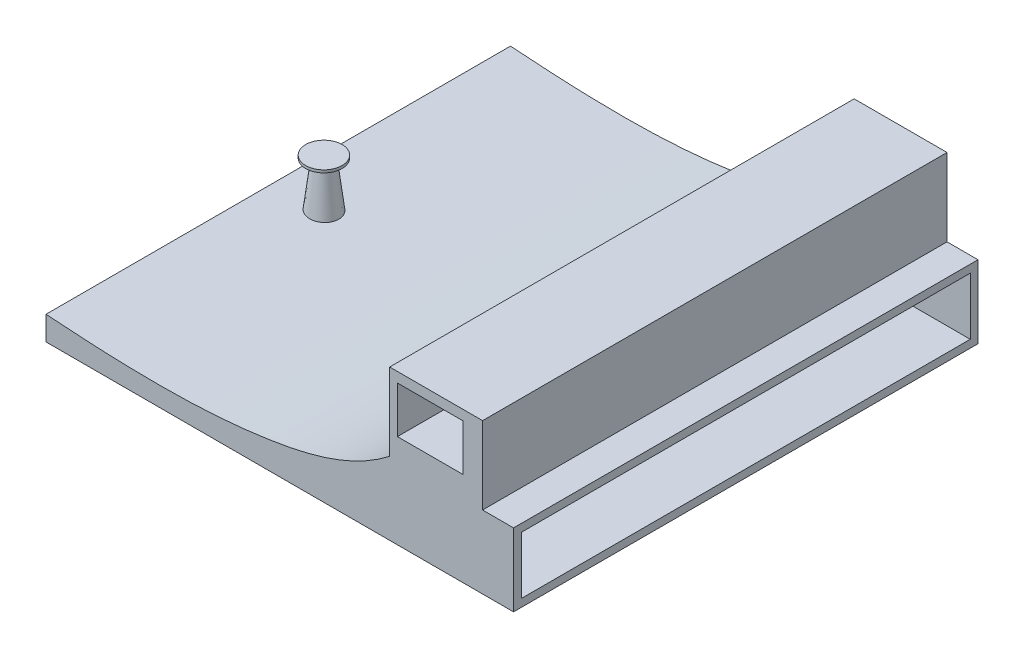
ISO-10303-21;
HEADER;
FILE_DESCRIPTION(('STEP AP214'),'2;1');
FILE_NAME('part.step','',(''),(''),'','','');
FILE_SCHEMA(('AUTOMOTIVE_DESIGN { 1 0 10303 214 1 1 1 1 }'));
ENDSEC;
DATA;
#1=APPLICATION_CONTEXT('core data for automotive mechanical design processes');
#2=APPLICATION_PROTOCOL_DEFINITION('international standard','automotive_design',2000,#1);
#3=PRODUCT_CONTEXT('',#1,'mechanical');
#4=PRODUCT('Part','Part','',(#3));
#5=PRODUCT_RELATED_PRODUCT_CATEGORY('part','',(#4));
#6=PRODUCT_DEFINITION_FORMATION('','',#4);
#7=PRODUCT_DEFINITION_CONTEXT('part definition',#1,'design');
#8=PRODUCT_DEFINITION('design','',#6,#7);
#9=PRODUCT_DEFINITION_SHAPE('','',#8);
#10=(LENGTH_UNIT() NAMED_UNIT(*) SI_UNIT(.MILLI.,.METRE.));
#11=(NAMED_UNIT(*) PLANE_ANGLE_UNIT() SI_UNIT($,.RADIAN.));
#12=(NAMED_UNIT(*) SI_UNIT($,.STERADIAN.) SOLID_ANGLE_UNIT());
#13=UNCERTAINTY_MEASURE_WITH_UNIT(LENGTH_MEASURE(1.E-05),#10,'distance_accuracy_value','');
#14=(GEOMETRIC_REPRESENTATION_CONTEXT(3) GLOBAL_UNCERTAINTY_ASSIGNED_CONTEXT((#13)) GLOBAL_UNIT_ASSIGNED_CONTEXT((#10,
#11,#12)) REPRESENTATION_CONTEXT('',''));
#15=CARTESIAN_POINT('',(0.,0.,0.));
#16=DIRECTION('',(0.,0.,1.));
#17=DIRECTION('',(1.,0.,0.));
#18=AXIS2_PLACEMENT_3D('',#15,#16,#17);
#19=CARTESIAN_POINT('',(19.7,0.,30.));
#20=CARTESIAN_POINT('',(15.0434377235675,-3.57470660710281,30.));
#21=CARTESIAN_POINT('',(0.818334701883255,-7.47775232832644,30.));
#22=CARTESIAN_POINT('',(-14.2263779060661,-7.04645507884953,30.));
#23=CARTESIAN_POINT('',(-24.7,-6.3,30.));
#24=B_SPLINE_CURVE_WITH_KNOTS('',3,(#19,#20,#21,#22,#23),.UNSPECIFIED.,.F.,.F.,(4,1,4),(0.,
0.353407129218657,1.),.UNSPECIFIED.);
#25=DIRECTION('',(0.,0.,-1.));
#26=VECTOR('',#25,1.);
#27=SURFACE_OF_LINEAR_EXTRUSION('',#24,#26);
#28=CARTESIAN_POINT('',(-18.8,-6.66602804813645,-1.91429584051757));
#29=CARTESIAN_POINT('',(-18.6924915121834,-6.6715048789084,-1.91496356974284));
#30=CARTESIAN_POINT('',(-18.5848446846226,-6.67691164162243,-1.90654536019111));
#31=CARTESIAN_POINT('',(-18.372393046309,-6.68742991783636,-1.87172685854549));
#32=CARTESIAN_POINT('',(-18.2675917961326,-6.69254106973414,-1.84530502820389));
#33=CARTESIAN_POINT('',(-18.0639407157916,-6.70233181966638,-1.77522301691739));
#34=CARTESIAN_POINT('',(-17.9650882444739,-6.70701160971599,-1.73157055212382));
#35=CARTESIAN_POINT('',(-17.776134584814,-6.71583467419774,-1.62827251440383));
#36=CARTESIAN_POINT('',(-17.6860312178573,-6.71997808228043,-1.56863093691014));
#37=CARTESIAN_POINT('',(-17.5171505432939,-6.72764663111186,-1.43507239452954));
#38=CARTESIAN_POINT('',(-17.4383678711419,-6.73117206487583,-1.36116223027944));
#39=CARTESIAN_POINT('',(-17.2943192877726,-6.73754805547265,-1.20114185440095));
#40=CARTESIAN_POINT('',(-17.2290538656745,-6.74039858788485,-1.11503120148993));
#41=CARTESIAN_POINT('',(-17.1139357380366,-6.74538310983117,-0.933110431292793));
#42=CARTESIAN_POINT('',(-17.0640742204118,-6.74751750910271,-0.837305901367277));
#43=CARTESIAN_POINT('',(-16.9811323412933,-6.75104701758724,-0.638676618998362));
#44=CARTESIAN_POINT('',(-16.9480519210757,-6.75244212938729,-0.535851891122939));
#45=CARTESIAN_POINT('',(-16.8996195821849,-6.7544789639261,-0.326129175736997));
#46=CARTESIAN_POINT('',(-16.8842631594422,-6.75512087807013,-0.219232230205312));
#47=CARTESIAN_POINT('',(-16.8717003383892,-6.75564628750913,-0.00437544663515091));
#48=CARTESIAN_POINT('',(-16.8744938979608,-6.75552978456405,0.103584388936244));
#49=CARTESIAN_POINT('',(-16.8981507661813,-6.75453939088244,0.317495370019751));
#50=CARTESIAN_POINT('',(-16.9190129454275,-6.75366554748448,0.423446640656864));
#51=CARTESIAN_POINT('',(-16.9782122743618,-6.75116847771316,0.630339991939915));
#52=CARTESIAN_POINT('',(-17.0165494357201,-6.74954525083935,0.731282069240516));
#53=CARTESIAN_POINT('',(-17.109609371067,-6.74556625234415,0.925294074556622));
#54=CARTESIAN_POINT('',(-17.1643324854653,-6.74321046550416,1.01836383897734));
#55=CARTESIAN_POINT('',(-17.2886074838189,-6.7377954963967,1.19398834058597));
#56=CARTESIAN_POINT('',(-17.3581593635877,-6.73473631432781,1.27654308074256));
#57=CARTESIAN_POINT('',(-17.5101258885471,-6.7279593898882,1.42880927169792));
#58=CARTESIAN_POINT('',(-17.5925425342527,-6.72424154508102,1.49851872132792));
#59=CARTESIAN_POINT('',(-17.7678875604058,-6.7162130743914,1.62310466920494));
#60=CARTESIAN_POINT('',(-17.8608159610838,-6.7119024473681,1.67798113890414));
#61=CARTESIAN_POINT('',(-18.0545864571374,-6.70277485480792,1.77137058135963));
#62=CARTESIAN_POINT('',(-18.155431923058,-6.69795767331527,1.80987653942534));
#63=CARTESIAN_POINT('',(-18.3621385814709,-6.6879312314173,1.86940560210985));
#64=CARTESIAN_POINT('',(-18.4679997932016,-6.68272196950808,1.89042863966561));
#65=CARTESIAN_POINT('',(-18.6818096736075,-6.67204385874169,1.91441062747813));
#66=CARTESIAN_POINT('',(-18.7897597217482,-6.66657483461183,1.91735720114108));
#67=CARTESIAN_POINT('',(-19.0046157670867,-6.65553736071709,1.90507459349327));
#68=CARTESIAN_POINT('',(-19.1115217597798,-6.64996891052352,1.88984533379527));
#69=CARTESIAN_POINT('',(-19.3213245462006,-6.63890136780307,1.84162981705352));
#70=CARTESIAN_POINT('',(-19.4242188492536,-6.63340231975358,1.8086327112686));
#71=CARTESIAN_POINT('',(-19.6230098276266,-6.62265800503813,1.72580932190966));
#72=CARTESIAN_POINT('',(-19.7189064931473,-6.61741273872756,1.67598301476922));
#73=CARTESIAN_POINT('',(-19.9009840969252,-6.60735701286247,1.56090760762976));
#74=CARTESIAN_POINT('',(-19.9871644898293,-6.60254657771707,1.49565764257035));
#75=CARTESIAN_POINT('',(-20.1473510515376,-6.59353381805627,1.3515834455082));
#76=CARTESIAN_POINT('',(-20.2213572542972,-6.58933149184479,1.27275925136689));
#77=CARTESIAN_POINT('',(-20.3550366386405,-6.58169351086133,1.10383195375584));
#78=CARTESIAN_POINT('',(-20.414720039762,-6.57825730957244,1.0137369624188));
#79=CARTESIAN_POINT('',(-20.5181170748599,-6.57227803028077,0.824780072561964));
#80=CARTESIAN_POINT('',(-20.5618308310192,-6.56973494544481,0.725918241124012));
#81=CARTESIAN_POINT('',(-20.6319962876488,-6.56564230890773,0.52235649498092));
#82=CARTESIAN_POINT('',(-20.6584678964585,-6.5640916114005,0.417663465391006));
#83=CARTESIAN_POINT('',(-20.6934716052306,-6.56203939924897,0.205310120124707));
#84=CARTESIAN_POINT('',(-20.7020037789704,-6.56153788028985,0.0976498166533377));
#85=CARTESIAN_POINT('',(-20.700884709075,-6.56160359685121,-0.117480464869074));
#86=CARTESIAN_POINT('',(-20.6912495068798,-6.5621698895148,-0.224950527035803));
#87=CARTESIAN_POINT('',(-20.6541031269037,-6.56434726050265,-0.436744574873437));
#88=CARTESIAN_POINT('',(-20.6265919358446,-6.56595833960297,-0.541068558207398));
#89=CARTESIAN_POINT('',(-20.5544800594214,-6.57016274939898,-0.743610959644414));
#90=CARTESIAN_POINT('',(-20.5098794039254,-6.57275607837794,-0.841829388418073));
#91=CARTESIAN_POINT('',(-20.4048624552829,-6.57882537176464,-1.02937673445745));
#92=CARTESIAN_POINT('',(-20.3444467186405,-6.58230130511501,-1.11870596436529));
#93=CARTESIAN_POINT('',(-20.2094674429684,-6.59000762412065,-1.2860182209329));
#94=CARTESIAN_POINT('',(-20.1348933528925,-6.59423857228367,-1.36399270878004));
#95=CARTESIAN_POINT('',(-19.9737210244737,-6.60329847046779,-1.5063327648305));
#96=CARTESIAN_POINT('',(-19.8871197290494,-6.60812757249411,-1.57069486250264));
#97=CARTESIAN_POINT('',(-19.704225820549,-6.61821783497625,-1.68406137931851));
#98=CARTESIAN_POINT('',(-19.6079175836383,-6.62347968938233,-1.73304049999763));
#99=CARTESIAN_POINT('',(-19.4085300874477,-6.63424331663139,-1.81406914420823));
#100=CARTESIAN_POINT('',(-19.3054590595388,-6.63974479516874,-1.84613883459288));
#101=CARTESIAN_POINT('',(-19.1347762308071,-6.64873725138461,-1.88384504992259));
#102=CARTESIAN_POINT('',(-19.0683077616217,-6.65221124216338,-1.89488108613009));
#103=CARTESIAN_POINT('',(-18.9345776077653,-6.65914199492545,-1.90989743648104));
#104=CARTESIAN_POINT('',(-18.8673159224704,-6.66259875689521,-1.91387774507533));
#105=CARTESIAN_POINT('',(-18.8,-6.66602804813645,-1.91429584051757));
#106=B_SPLINE_CURVE_WITH_KNOTS('',3,(#28,#29,#30,#31,#32,#33,#34,#35,#36,#37,#38,#39,#40,#41,
#42,#43,#44,#45,#46,#47,#48,#49,#50,#51,#52,#53,#54,#55,#56,#57,#58,#59,#60,#61,#62,#63,#64,#65,
#66,#67,#68,#69,#70,#71,#72,#73,#74,#75,#76,#77,#78,#79,#80,#81,#82,#83,#84,#85,#86,#87,#88,#89,
#90,#91,#92,#93,#94,#95,#96,#97,#98,#99,#100,#101,#102,#103,#104,#105),.UNSPECIFIED.,.T.,.F.,(4,
2,2,2,2,2,2,2,2,2,2,2,2,2,2,2,2,2,2,2,2,2,2,2,2,2,2,2,2,2,2,2,2,2,2,2,2,2,4),(0.,
0.32270407892277,0.645794897371466,0.968741194476369,1.29160686737989,1.61431903556232,
1.93704287898574,2.25958175899695,2.58211951030477,2.90457527940052,3.22703030021841,
3.54946516701739,3.87190024914824,4.19434203016747,4.51678372015223,4.83927560096048,
5.16176810243784,5.48439865156418,5.80703043826919,6.12988309988378,6.45273715387576,
6.77578856090087,7.09884042030637,7.42191040289017,7.74497948437714,8.06781736116335,
8.39065276788189,8.71311475452316,9.035575415009,9.35775148232497,9.67992778895113,
10.0021035324979,10.3242679407895,10.6466733806085,10.9691609201084,11.2921760707171,
11.6148051043279,11.8168645520431,12.0189241586734),.UNSPECIFIED.);
#107=CARTESIAN_POINT('',(-18.8,-6.66602804813645,-1.91429584051757));
#108=VERTEX_POINT('',#107);
#109=EDGE_CURVE('E51',#108,#108,#106,.T.);
#110=ORIENTED_EDGE('',*,*,#109,.T.);
#111=EDGE_LOOP('',(#110));
#112=FACE_BOUND('',#111,.T.);
#113=CARTESIAN_POINT('',(19.7,0.,-30.));
#114=CARTESIAN_POINT('',(15.0434377235675,-3.57470660710281,-30.));
#115=CARTESIAN_POINT('',(0.818334701883255,-7.47775232832644,-30.));
#116=CARTESIAN_POINT('',(-14.2263779060661,-7.04645507884953,-30.));
#117=CARTESIAN_POINT('',(-24.7,-6.3,-30.));
#118=B_SPLINE_CURVE_WITH_KNOTS('',3,(#113,#114,#115,#116,#117),.UNSPECIFIED.,.F.,.F.,(4,1,4),
(0.,0.353407129218657,1.),.UNSPECIFIED.);
#119=CARTESIAN_POINT('',(19.7,0.,-30.));
#120=VERTEX_POINT('',#119);
#121=CARTESIAN_POINT('',(-24.7,-6.30000000000001,-30.));
#122=VERTEX_POINT('',#121);
#123=EDGE_CURVE('E429',#120,#122,#118,.T.);
#124=ORIENTED_EDGE('',*,*,#123,.T.);
#125=DIRECTION('',(0.,0.,-1.));
#126=VECTOR('',#125,1.);
#127=CARTESIAN_POINT('',(-24.7,-6.30000000000001,30.));
#128=LINE('',#127,#126);
#129=CARTESIAN_POINT('',(-24.7,-6.30000000000001,30.));
#130=VERTEX_POINT('',#129);
#131=EDGE_CURVE('E61',#130,#122,#128,.T.);
#132=ORIENTED_EDGE('',*,*,#131,.F.);
#133=CARTESIAN_POINT('',(19.7,0.,30.));
#134=VERTEX_POINT('',#133);
#135=EDGE_CURVE('E326',#134,#130,#24,.T.);
#136=ORIENTED_EDGE('',*,*,#135,.F.);
#137=DIRECTION('',(0.,0.,-1.));
#138=VECTOR('',#137,1.);
#139=CARTESIAN_POINT('',(19.7,0.,30.));
#140=LINE('',#139,#138);
#141=EDGE_CURVE('E11',#134,#120,#140,.T.);
#142=ORIENTED_EDGE('',*,*,#141,.T.);
#143=EDGE_LOOP('',(#124,#132,#136,#142));
#144=FACE_BOUND('',#143,.T.);
#145=ADVANCED_FACE('F47',(#112,#144),#27,.F.);
#146=CARTESIAN_POINT('',(-24.7,-9.40000000000001,30.));
#147=DIRECTION('',(0.,1.,0.));
#148=DIRECTION('',(-1.,0.,0.));
#149=AXIS2_PLACEMENT_3D('',#146,#147,#148);
#150=PLANE('',#149);
#151=DIRECTION('',(1.,0.,0.));
#152=VECTOR('',#151,1.);
#153=CARTESIAN_POINT('',(-24.7,-9.40000000000001,-30.));
#154=LINE('',#153,#152);
#155=CARTESIAN_POINT('',(-24.7,-9.4,-30.));
#156=VERTEX_POINT('',#155);
#157=CARTESIAN_POINT('',(35.7,-9.4,-30.));
#158=VERTEX_POINT('',#157);
#159=EDGE_CURVE('E333',#156,#158,#154,.T.);
#160=ORIENTED_EDGE('',*,*,#159,.T.);
#161=DIRECTION('',(0.,0.,-1.));
#162=VECTOR('',#161,1.);
#163=CARTESIAN_POINT('',(35.7,-9.4,30.));
#164=LINE('',#163,#162);
#165=CARTESIAN_POINT('',(35.7,-9.4,30.));
#166=VERTEX_POINT('',#165);
#167=EDGE_CURVE('E223',#166,#158,#164,.T.);
#168=ORIENTED_EDGE('',*,*,#167,.F.);
#169=DIRECTION('',(1.,0.,0.));
#170=VECTOR('',#169,1.);
#171=CARTESIAN_POINT('',(-24.7,-9.40000000000001,30.));
#172=LINE('',#171,#170);
#173=CARTESIAN_POINT('',(-24.7,-9.40000000000001,30.));
#174=VERTEX_POINT('',#173);
#175=EDGE_CURVE('E450',#174,#166,#172,.T.);
#176=ORIENTED_EDGE('',*,*,#175,.F.);
#177=DIRECTION('',(0.,0.,-1.));
#178=VECTOR('',#177,1.);
#179=CARTESIAN_POINT('',(-24.7,-9.40000000000001,30.));
#180=LINE('',#179,#178);
#181=EDGE_CURVE('E455',#174,#156,#180,.T.);
#182=ORIENTED_EDGE('',*,*,#181,.T.);
#183=EDGE_LOOP('',(#160,#168,#176,#182));
#184=FACE_BOUND('',#183,.T.);
#185=ADVANCED_FACE('F341',(#184),#150,.F.);
#186=CARTESIAN_POINT('',(-1.55425185978764,-6.57115875064027,30.));
#187=DIRECTION('',(0.,0.,1.));
#188=DIRECTION('',(1.,0.,0.));
#189=AXIS2_PLACEMENT_3D('',#186,#187,#188);
#190=PLANE('',#189);
#191=DIRECTION('',(0.,1.,0.));
#192=VECTOR('',#191,1.);
#193=CARTESIAN_POINT('',(20.6981704833567,8.70970961026014,30.));
#194=LINE('',#193,#192);
#195=CARTESIAN_POINT('',(20.6981704833567,2.70970961026014,30.));
#196=VERTEX_POINT('',#195);
#197=CARTESIAN_POINT('',(20.6981704833567,8.70970961026014,30.));
#198=VERTEX_POINT('',#197);
#199=EDGE_CURVE('E168',#196,#198,#194,.T.);
#200=ORIENTED_EDGE('',*,*,#199,.T.);
#201=DIRECTION('',(1.,0.,0.));
#202=VECTOR('',#201,1.);
#203=CARTESIAN_POINT('',(29.1981704833567,8.70970961026014,30.));
#204=LINE('',#203,#202);
#205=CARTESIAN_POINT('',(29.1981704833567,8.70970961026014,30.));
#206=VERTEX_POINT('',#205);
#207=EDGE_CURVE('E178',#198,#206,#204,.T.);
#208=ORIENTED_EDGE('',*,*,#207,.T.);
#209=DIRECTION('',(0.,-1.,0.));
#210=VECTOR('',#209,1.);
#211=CARTESIAN_POINT('',(29.1981704833567,8.70970961026014,30.));
#212=LINE('',#211,#210);
#213=CARTESIAN_POINT('',(29.1981704833567,2.70970961026014,30.));
#214=VERTEX_POINT('',#213);
#215=EDGE_CURVE('E68',#206,#214,#212,.T.);
#216=ORIENTED_EDGE('',*,*,#215,.T.);
#217=DIRECTION('',(-1.,0.,0.));
#218=VECTOR('',#217,1.);
#219=CARTESIAN_POINT('',(29.1981704833567,2.70970961026014,30.));
#220=LINE('',#219,#218);
#221=EDGE_CURVE('E175',#214,#196,#220,.T.);
#222=ORIENTED_EDGE('',*,*,#221,.T.);
#223=EDGE_LOOP('',(#200,#208,#216,#222));
#224=FACE_BOUND('',#223,.T.);
#225=ORIENTED_EDGE('',*,*,#175,.T.);
#226=DIRECTION('',(0.,-1.,0.));
#227=VECTOR('',#226,1.);
#228=CARTESIAN_POINT('',(35.7,0.,30.));
#229=LINE('',#228,#227);
#230=CARTESIAN_POINT('',(35.7,0.,30.));
#231=VERTEX_POINT('',#230);
#232=EDGE_CURVE('E266',#231,#166,#229,.T.);
#233=ORIENTED_EDGE('',*,*,#232,.F.);
#234=DIRECTION('',(-1.,0.,0.));
#235=VECTOR('',#234,1.);
#236=CARTESIAN_POINT('',(35.7,0.,30.));
#237=LINE('',#236,#235);
#238=CARTESIAN_POINT('',(31.7,0.,30.));
#239=VERTEX_POINT('',#238);
#240=EDGE_CURVE('E270',#231,#239,#237,.T.);
#241=ORIENTED_EDGE('',*,*,#240,.T.);
#242=DIRECTION('',(0.,-1.,0.));
#243=VECTOR('',#242,1.);
#244=CARTESIAN_POINT('',(31.7,10.,30.));
#245=LINE('',#244,#243);
#246=CARTESIAN_POINT('',(31.7,10.,30.));
#247=VERTEX_POINT('',#246);
#248=EDGE_CURVE('E302',#247,#239,#245,.T.);
#249=ORIENTED_EDGE('',*,*,#248,.F.);
#250=DIRECTION('',(1.,0.,0.));
#251=VECTOR('',#250,1.);
#252=CARTESIAN_POINT('',(19.7,10.,30.));
#253=LINE('',#252,#251);
#254=CARTESIAN_POINT('',(19.7,10.,30.));
#255=VERTEX_POINT('',#254);
#256=EDGE_CURVE('E282',#255,#247,#253,.T.);
#257=ORIENTED_EDGE('',*,*,#256,.F.);
#258=DIRECTION('',(0.,-1.,0.));
#259=VECTOR('',#258,1.);
#260=CARTESIAN_POINT('',(19.7,10.,30.));
#261=LINE('',#260,#259);
#262=EDGE_CURVE('E306',#255,#134,#261,.T.);
#263=ORIENTED_EDGE('',*,*,#262,.T.);
#264=ORIENTED_EDGE('',*,*,#135,.T.);
#265=DIRECTION('',(0.,-1.,0.));
#266=VECTOR('',#265,1.);
#267=CARTESIAN_POINT('',(-24.7,-9.40000000000001,30.));
#268=LINE('',#267,#266);
#269=EDGE_CURVE('E332',#130,#174,#268,.T.);
#270=ORIENTED_EDGE('',*,*,#269,.T.);
#271=EDGE_LOOP('',(#225,#233,#241,#249,#257,#263,#264,#270));
#272=FACE_BOUND('',#271,.T.);
#273=ADVANCED_FACE('F183',(#224,#272),#190,.T.);
#274=CARTESIAN_POINT('',(-1.55425185978764,-6.57115875064027,-30.));
#275=DIRECTION('',(0.,0.,1.));
#276=DIRECTION('',(1.,0.,0.));
#277=AXIS2_PLACEMENT_3D('',#274,#275,#276);
#278=PLANE('',#277);
#279=DIRECTION('',(1.,0.,0.));
#280=VECTOR('',#279,1.);
#281=CARTESIAN_POINT('',(29.1981704833567,8.70970961026014,-30.));
#282=LINE('',#281,#280);
#283=CARTESIAN_POINT('',(20.6981704833567,8.70970961026014,-30.));
#284=VERTEX_POINT('',#283);
#285=CARTESIAN_POINT('',(29.1981704833567,8.70970961026014,-30.));
#286=VERTEX_POINT('',#285);
#287=EDGE_CURVE('E200',#284,#286,#282,.T.);
#288=ORIENTED_EDGE('',*,*,#287,.F.);
#289=DIRECTION('',(0.,1.,0.));
#290=VECTOR('',#289,1.);
#291=CARTESIAN_POINT('',(20.6981704833567,8.70970961026014,-30.));
#292=LINE('',#291,#290);
#293=CARTESIAN_POINT('',(20.6981704833567,2.70970961026014,-30.));
#294=VERTEX_POINT('',#293);
#295=EDGE_CURVE('E76',#294,#284,#292,.T.);
#296=ORIENTED_EDGE('',*,*,#295,.F.);
#297=DIRECTION('',(-1.,0.,0.));
#298=VECTOR('',#297,1.);
#299=CARTESIAN_POINT('',(29.1981704833567,2.70970961026014,-30.));
#300=LINE('',#299,#298);
#301=CARTESIAN_POINT('',(29.1981704833567,2.70970961026014,-30.));
#302=VERTEX_POINT('',#301);
#303=EDGE_CURVE('E187',#302,#294,#300,.T.);
#304=ORIENTED_EDGE('',*,*,#303,.F.);
#305=DIRECTION('',(0.,-1.,0.));
#306=VECTOR('',#305,1.);
#307=CARTESIAN_POINT('',(29.1981704833567,8.70970961026014,-30.));
#308=LINE('',#307,#306);
#309=EDGE_CURVE('E191',#286,#302,#308,.T.);
#310=ORIENTED_EDGE('',*,*,#309,.F.);
#311=EDGE_LOOP('',(#288,#296,#304,#310));
#312=FACE_BOUND('',#311,.T.);
#313=ORIENTED_EDGE('',*,*,#123,.F.);
#314=DIRECTION('',(0.,-1.,0.));
#315=VECTOR('',#314,1.);
#316=CARTESIAN_POINT('',(19.7,10.,-30.));
#317=LINE('',#316,#315);
#318=CARTESIAN_POINT('',(19.7,10.,-30.));
#319=VERTEX_POINT('',#318);
#320=EDGE_CURVE('E291',#319,#120,#317,.T.);
#321=ORIENTED_EDGE('',*,*,#320,.F.);
#322=DIRECTION('',(-1.,0.,0.));
#323=VECTOR('',#322,1.);
#324=CARTESIAN_POINT('',(19.7,10.,-30.));
#325=LINE('',#324,#323);
#326=CARTESIAN_POINT('',(31.7,10.,-30.));
#327=VERTEX_POINT('',#326);
#328=EDGE_CURVE('E288',#327,#319,#325,.T.);
#329=ORIENTED_EDGE('',*,*,#328,.F.);
#330=DIRECTION('',(0.,-1.,0.));
#331=VECTOR('',#330,1.);
#332=CARTESIAN_POINT('',(31.7,10.,-30.));
#333=LINE('',#332,#331);
#334=CARTESIAN_POINT('',(31.7,0.,-30.));
#335=VERTEX_POINT('',#334);
#336=EDGE_CURVE('E298',#327,#335,#333,.T.);
#337=ORIENTED_EDGE('',*,*,#336,.T.);
#338=DIRECTION('',(-1.,0.,0.));
#339=VECTOR('',#338,1.);
#340=CARTESIAN_POINT('',(35.7,0.,-30.));
#341=LINE('',#340,#339);
#342=CARTESIAN_POINT('',(35.7,0.,-30.));
#343=VERTEX_POINT('',#342);
#344=EDGE_CURVE('E274',#343,#335,#341,.T.);
#345=ORIENTED_EDGE('',*,*,#344,.F.);
#346=DIRECTION('',(0.,1.,0.));
#347=VECTOR('',#346,1.);
#348=CARTESIAN_POINT('',(35.7,-9.4,-30.));
#349=LINE('',#348,#347);
#350=EDGE_CURVE('E260',#158,#343,#349,.T.);
#351=ORIENTED_EDGE('',*,*,#350,.F.);
#352=ORIENTED_EDGE('',*,*,#159,.F.);
#353=DIRECTION('',(0.,-1.,0.));
#354=VECTOR('',#353,1.);
#355=CARTESIAN_POINT('',(-24.7,-9.40000000000001,-30.));
#356=LINE('',#355,#354);
#357=EDGE_CURVE('E433',#122,#156,#356,.T.);
#358=ORIENTED_EDGE('',*,*,#357,.F.);
#359=EDGE_LOOP('',(#313,#321,#329,#337,#345,#351,#352,#358));
#360=FACE_BOUND('',#359,.T.);
#361=ADVANCED_FACE('F346',(#312,#360),#278,.F.);
#362=CARTESIAN_POINT('',(-24.7,10.,-70.));
#363=DIRECTION('',(1.,0.,0.));
#364=DIRECTION('',(0.,0.,-1.));
#365=AXIS2_PLACEMENT_3D('',#362,#363,#364);
#366=PLANE('',#365);
#367=ORIENTED_EDGE('',*,*,#269,.F.);
#368=ORIENTED_EDGE('',*,*,#131,.T.);
#369=ORIENTED_EDGE('',*,*,#357,.T.);
#370=ORIENTED_EDGE('',*,*,#181,.F.);
#371=EDGE_LOOP('',(#367,#368,#369,#370));
#372=FACE_BOUND('',#371,.T.);
#373=ADVANCED_FACE('F49',(#372),#366,.F.);
#374=CARTESIAN_POINT('',(-18.8,-1.36716403954,0.));
#375=DIRECTION('',(0.,-1.,0.));
#376=DIRECTION('',(0.,0.,-1.));
#377=AXIS2_PLACEMENT_3D('',#374,#375,#376);
#378=CONICAL_SURFACE('',#377,1.26367714993789,0.122173047639596);
#379=CARTESIAN_POINT('',(-18.8,-1.36716403954,0.));
#380=DIRECTION('',(0.,1.,0.));
#381=DIRECTION('',(0.,0.,1.));
#382=AXIS2_PLACEMENT_3D('',#379,#380,#381);
#383=CIRCLE('',#382,1.26367714993789);
#384=CARTESIAN_POINT('',(-18.8,-1.36716403954,1.26367714993789));
#385=VERTEX_POINT('',#384);
#386=EDGE_CURVE('E322',#385,#385,#383,.T.);
#387=ORIENTED_EDGE('',*,*,#386,.F.);
#388=EDGE_LOOP('',(#387));
#389=FACE_BOUND('',#388,.T.);
#390=ORIENTED_EDGE('',*,*,#109,.F.);
#391=EDGE_LOOP('',(#390));
#392=FACE_BOUND('',#391,.T.);
#393=ADVANCED_FACE('F351',(#389,#392),#378,.T.);
#394=CARTESIAN_POINT('',(-18.8,-1.30622936783743,0.));
#395=DIRECTION('',(0.,1.,0.));
#396=DIRECTION('',(0.,0.,1.));
#397=AXIS2_PLACEMENT_3D('',#394,#395,#396);
#398=TOROIDAL_SURFACE('',#397,1.75995022575855,0.5);
#399=ORIENTED_EDGE('',*,*,#386,.T.);
#400=EDGE_LOOP('',(#399));
#401=FACE_BOUND('',#400,.T.);
#402=CARTESIAN_POINT('',(-18.8,-0.876316192649099,0.));
#403=DIRECTION('',(0.,1.,0.));
#404=DIRECTION('',(0.,0.,1.));
#405=AXIS2_PLACEMENT_3D('',#402,#403,#404);
#406=CIRCLE('',#405,1.50465693990974);
#407=CARTESIAN_POINT('',(-18.8,-0.876316192649099,1.50465693990974));
#408=VERTEX_POINT('',#407);
#409=EDGE_CURVE('E318',#408,#408,#406,.T.);
#410=ORIENTED_EDGE('',*,*,#409,.F.);
#411=EDGE_LOOP('',(#410));
#412=FACE_BOUND('',#411,.T.);
#413=ADVANCED_FACE('F355',(#401,#412),#398,.F.);
#414=CARTESIAN_POINT('',(-20.3046569399097,-0.876316192649099,0.));
#415=DIRECTION('',(0.,-1.,0.));
#416=DIRECTION('',(0.,0.,-1.));
#417=AXIS2_PLACEMENT_3D('',#414,#415,#416);
#418=PLANE('',#417);
#419=ORIENTED_EDGE('',*,*,#409,.T.);
#420=EDGE_LOOP('',(#419));
#421=FACE_BOUND('',#420,.T.);
#422=CARTESIAN_POINT('',(-18.8,-0.876316192649099,0.));
#423=DIRECTION('',(0.,1.,0.));
#424=DIRECTION('',(0.,0.,1.));
#425=AXIS2_PLACEMENT_3D('',#422,#423,#424);
#426=CIRCLE('',#425,2.35076423068686);
#427=CARTESIAN_POINT('',(-18.8,-0.876316192649099,2.35076423068686));
#428=VERTEX_POINT('',#427);
#429=EDGE_CURVE('E314',#428,#428,#426,.T.);
#430=ORIENTED_EDGE('',*,*,#429,.F.);
#431=EDGE_LOOP('',(#430));
#432=FACE_BOUND('',#431,.T.);
#433=ADVANCED_FACE('F359',(#421,#432),#418,.T.);
#434=CARTESIAN_POINT('',(-18.8,-0.876316192649098,0.));
#435=DIRECTION('',(0.,1.,0.));
#436=DIRECTION('',(0.,0.,1.));
#437=AXIS2_PLACEMENT_3D('',#434,#435,#436);
#438=CYLINDRICAL_SURFACE('',#437,2.35076423068686);
#439=ORIENTED_EDGE('',*,*,#429,.T.);
#440=EDGE_LOOP('',(#439));
#441=FACE_BOUND('',#440,.T.);
#442=CARTESIAN_POINT('',(-18.8,-0.535859851244897,0.));
#443=DIRECTION('',(0.,1.,0.));
#444=DIRECTION('',(0.,0.,1.));
#445=AXIS2_PLACEMENT_3D('',#442,#443,#444);
#446=CIRCLE('',#445,2.35076423068686);
#447=CARTESIAN_POINT('',(-18.8,-0.535859851244897,2.35076423068686));
#448=VERTEX_POINT('',#447);
#449=EDGE_CURVE('E310',#448,#448,#446,.T.);
#450=ORIENTED_EDGE('',*,*,#449,.F.);
#451=EDGE_LOOP('',(#450));
#452=FACE_BOUND('',#451,.T.);
#453=ADVANCED_FACE('F363',(#441,#452),#438,.T.);
#454=CARTESIAN_POINT('',(-18.8,-0.535859851244897,0.));
#455=DIRECTION('',(0.,1.,0.));
#456=DIRECTION('',(0.,0.,1.));
#457=AXIS2_PLACEMENT_3D('',#454,#455,#456);
#458=PLANE('',#457);
#459=ORIENTED_EDGE('',*,*,#449,.T.);
#460=EDGE_LOOP('',(#459));
#461=FACE_BOUND('',#460,.T.);
#462=ADVANCED_FACE('F367',(#461),#458,.T.);
#463=CARTESIAN_POINT('',(19.7,10.,30.));
#464=DIRECTION('',(1.,0.,0.));
#465=DIRECTION('',(0.,1.,0.));
#466=AXIS2_PLACEMENT_3D('',#463,#464,#465);
#467=PLANE('',#466);
#468=ORIENTED_EDGE('',*,*,#141,.F.);
#469=ORIENTED_EDGE('',*,*,#262,.F.);
#470=DIRECTION('',(0.,0.,1.));
#471=VECTOR('',#470,1.);
#472=CARTESIAN_POINT('',(19.7,10.,30.));
#473=LINE('',#472,#471);
#474=EDGE_CURVE('E278',#319,#255,#473,.T.);
#475=ORIENTED_EDGE('',*,*,#474,.F.);
#476=ORIENTED_EDGE('',*,*,#320,.T.);
#477=EDGE_LOOP('',(#468,#469,#475,#476));
#478=FACE_BOUND('',#477,.T.);
#479=ADVANCED_FACE('F371',(#478),#467,.F.);
#480=CARTESIAN_POINT('',(31.7,10.,30.));
#481=DIRECTION('',(-1.,0.,0.));
#482=DIRECTION('',(0.,-1.,0.));
#483=AXIS2_PLACEMENT_3D('',#480,#481,#482);
#484=PLANE('',#483);
#485=DIRECTION('',(0.,0.,-1.));
#486=VECTOR('',#485,1.);
#487=CARTESIAN_POINT('',(31.7,0.,30.));
#488=LINE('',#487,#486);
#489=EDGE_CURVE('E277',#239,#335,#488,.T.);
#490=ORIENTED_EDGE('',*,*,#489,.T.);
#491=ORIENTED_EDGE('',*,*,#336,.F.);
#492=DIRECTION('',(0.,0.,-1.));
#493=VECTOR('',#492,1.);
#494=CARTESIAN_POINT('',(31.7,10.,30.));
#495=LINE('',#494,#493);
#496=EDGE_CURVE('E285',#247,#327,#495,.T.);
#497=ORIENTED_EDGE('',*,*,#496,.F.);
#498=ORIENTED_EDGE('',*,*,#248,.T.);
#499=EDGE_LOOP('',(#490,#491,#497,#498));
#500=FACE_BOUND('',#499,.T.);
#501=ADVANCED_FACE('F375',(#500),#484,.F.);
#502=CARTESIAN_POINT('',(0.,10.,0.));
#503=DIRECTION('',(0.,-1.,0.));
#504=DIRECTION('',(1.,0.,0.));
#505=AXIS2_PLACEMENT_3D('',#502,#503,#504);
#506=PLANE('',#505);
#507=ORIENTED_EDGE('',*,*,#474,.T.);
#508=ORIENTED_EDGE('',*,*,#256,.T.);
#509=ORIENTED_EDGE('',*,*,#496,.T.);
#510=ORIENTED_EDGE('',*,*,#328,.T.);
#511=EDGE_LOOP('',(#507,#508,#509,#510));
#512=FACE_BOUND('',#511,.T.);
#513=ADVANCED_FACE('F379',(#512),#506,.F.);
#514=CARTESIAN_POINT('',(35.7,0.,-30.));
#515=DIRECTION('',(0.,-1.,0.));
#516=DIRECTION('',(0.,0.,-1.));
#517=AXIS2_PLACEMENT_3D('',#514,#515,#516);
#518=PLANE('',#517);
#519=ORIENTED_EDGE('',*,*,#344,.T.);
#520=ORIENTED_EDGE('',*,*,#489,.F.);
#521=ORIENTED_EDGE('',*,*,#240,.F.);
#522=DIRECTION('',(0.,0.,1.));
#523=VECTOR('',#522,1.);
#524=CARTESIAN_POINT('',(35.7,0.,-30.));
#525=LINE('',#524,#523);
#526=EDGE_CURVE('E263',#343,#231,#525,.T.);
#527=ORIENTED_EDGE('',*,*,#526,.F.);
#528=EDGE_LOOP('',(#519,#520,#521,#527));
#529=FACE_BOUND('',#528,.T.);
#530=ADVANCED_FACE('F383',(#529),#518,.F.);
#531=CARTESIAN_POINT('',(35.7,0.,0.));
#532=DIRECTION('',(1.,0.,0.));
#533=DIRECTION('',(0.,0.,-1.));
#534=AXIS2_PLACEMENT_3D('',#531,#532,#533);
#535=PLANE('',#534);
#536=DIRECTION('',(0.,0.,-1.));
#537=VECTOR('',#536,1.);
#538=CARTESIAN_POINT('',(35.7,-8.4,30.));
#539=LINE('',#538,#537);
#540=CARTESIAN_POINT('',(35.7,-8.4,29.));
#541=VERTEX_POINT('',#540);
#542=CARTESIAN_POINT('',(35.7,-8.4,-29.));
#543=VERTEX_POINT('',#542);
#544=EDGE_CURVE('E245',#541,#543,#539,.T.);
#545=ORIENTED_EDGE('',*,*,#544,.F.);
#546=DIRECTION('',(0.,-1.,0.));
#547=VECTOR('',#546,1.);
#548=CARTESIAN_POINT('',(35.7,0.,29.));
#549=LINE('',#548,#547);
#550=CARTESIAN_POINT('',(35.7,-1.,29.));
#551=VERTEX_POINT('',#550);
#552=EDGE_CURVE('E230',#551,#541,#549,.T.);
#553=ORIENTED_EDGE('',*,*,#552,.F.);
#554=DIRECTION('',(0.,0.,1.));
#555=VECTOR('',#554,1.);
#556=CARTESIAN_POINT('',(35.7,-1.,-30.));
#557=LINE('',#556,#555);
#558=CARTESIAN_POINT('',(35.7,-1.,-29.));
#559=VERTEX_POINT('',#558);
#560=EDGE_CURVE('E251',#559,#551,#557,.T.);
#561=ORIENTED_EDGE('',*,*,#560,.F.);
#562=DIRECTION('',(0.,1.,0.));
#563=VECTOR('',#562,1.);
#564=CARTESIAN_POINT('',(35.7,-9.4,-29.));
#565=LINE('',#564,#563);
#566=EDGE_CURVE('E248',#543,#559,#565,.T.);
#567=ORIENTED_EDGE('',*,*,#566,.F.);
#568=EDGE_LOOP('',(#545,#553,#561,#567));
#569=FACE_BOUND('',#568,.T.);
#570=ORIENTED_EDGE('',*,*,#167,.T.);
#571=ORIENTED_EDGE('',*,*,#350,.T.);
#572=ORIENTED_EDGE('',*,*,#526,.T.);
#573=ORIENTED_EDGE('',*,*,#232,.T.);
#574=EDGE_LOOP('',(#570,#571,#572,#573));
#575=FACE_BOUND('',#574,.T.);
#576=ADVANCED_FACE('F387',(#569,#575),#535,.T.);
#577=CARTESIAN_POINT('',(35.7,-8.4,30.));
#578=DIRECTION('',(0.,1.,0.));
#579=DIRECTION('',(0.,0.,1.));
#580=AXIS2_PLACEMENT_3D('',#577,#578,#579);
#581=PLANE('',#580);
#582=DIRECTION('',(0.,0.,-1.));
#583=VECTOR('',#582,1.);
#584=CARTESIAN_POINT('',(25.7,-8.4,30.));
#585=LINE('',#584,#583);
#586=CARTESIAN_POINT('',(25.7,-8.4,29.));
#587=VERTEX_POINT('',#586);
#588=CARTESIAN_POINT('',(25.7,-8.4,-29.));
#589=VERTEX_POINT('',#588);
#590=EDGE_CURVE('E209',#587,#589,#585,.T.);
#591=ORIENTED_EDGE('',*,*,#590,.F.);
#592=DIRECTION('',(-1.,0.,0.));
#593=VECTOR('',#592,1.);
#594=CARTESIAN_POINT('',(35.7,-8.4,29.));
#595=LINE('',#594,#593);
#596=EDGE_CURVE('E225',#541,#587,#595,.T.);
#597=ORIENTED_EDGE('',*,*,#596,.F.);
#598=ORIENTED_EDGE('',*,*,#544,.T.);
#599=DIRECTION('',(-1.,0.,0.));
#600=VECTOR('',#599,1.);
#601=CARTESIAN_POINT('',(35.7,-8.4,-29.));
#602=LINE('',#601,#600);
#603=EDGE_CURVE('E219',#543,#589,#602,.T.);
#604=ORIENTED_EDGE('',*,*,#603,.T.);
#605=EDGE_LOOP('',(#591,#597,#598,#604));
#606=FACE_BOUND('',#605,.T.);
#607=ADVANCED_FACE('F391',(#606),#581,.T.);
#608=CARTESIAN_POINT('',(35.7,-9.4,-29.));
#609=DIRECTION('',(0.,0.,1.));
#610=DIRECTION('',(1.,0.,0.));
#611=AXIS2_PLACEMENT_3D('',#608,#609,#610);
#612=PLANE('',#611);
#613=DIRECTION('',(0.,1.,0.));
#614=VECTOR('',#613,1.);
#615=CARTESIAN_POINT('',(25.7,-9.4,-29.));
#616=LINE('',#615,#614);
#617=CARTESIAN_POINT('',(25.7,-1.,-29.));
#618=VERTEX_POINT('',#617);
#619=EDGE_CURVE('E218',#589,#618,#616,.T.);
#620=ORIENTED_EDGE('',*,*,#619,.F.);
#621=ORIENTED_EDGE('',*,*,#603,.F.);
#622=ORIENTED_EDGE('',*,*,#566,.T.);
#623=DIRECTION('',(-1.,0.,0.));
#624=VECTOR('',#623,1.);
#625=CARTESIAN_POINT('',(35.7,-1.,-29.));
#626=LINE('',#625,#624);
#627=EDGE_CURVE('E224',#559,#618,#626,.T.);
#628=ORIENTED_EDGE('',*,*,#627,.T.);
#629=EDGE_LOOP('',(#620,#621,#622,#628));
#630=FACE_BOUND('',#629,.T.);
#631=ADVANCED_FACE('F404',(#630),#612,.T.);
#632=CARTESIAN_POINT('',(35.7,-1.,-30.));
#633=DIRECTION('',(0.,-1.,0.));
#634=DIRECTION('',(0.,0.,-1.));
#635=AXIS2_PLACEMENT_3D('',#632,#633,#634);
#636=PLANE('',#635);
#637=DIRECTION('',(0.,0.,1.));
#638=VECTOR('',#637,1.);
#639=CARTESIAN_POINT('',(25.7,-1.,-30.));
#640=LINE('',#639,#638);
#641=CARTESIAN_POINT('',(25.7,-1.,29.));
#642=VERTEX_POINT('',#641);
#643=EDGE_CURVE('E233',#618,#642,#640,.T.);
#644=ORIENTED_EDGE('',*,*,#643,.F.);
#645=ORIENTED_EDGE('',*,*,#627,.F.);
#646=ORIENTED_EDGE('',*,*,#560,.T.);
#647=DIRECTION('',(-1.,0.,0.));
#648=VECTOR('',#647,1.);
#649=CARTESIAN_POINT('',(35.7,-1.,29.));
#650=LINE('',#649,#648);
#651=EDGE_CURVE('E229',#551,#642,#650,.T.);
#652=ORIENTED_EDGE('',*,*,#651,.T.);
#653=EDGE_LOOP('',(#644,#645,#646,#652));
#654=FACE_BOUND('',#653,.T.);
#655=ADVANCED_FACE('F400',(#654),#636,.T.);
#656=CARTESIAN_POINT('',(35.7,0.,29.));
#657=DIRECTION('',(0.,0.,-1.));
#658=DIRECTION('',(-1.,0.,0.));
#659=AXIS2_PLACEMENT_3D('',#656,#657,#658);
#660=PLANE('',#659);
#661=DIRECTION('',(0.,-1.,0.));
#662=VECTOR('',#661,1.);
#663=CARTESIAN_POINT('',(25.7,0.,29.));
#664=LINE('',#663,#662);
#665=EDGE_CURVE('E239',#642,#587,#664,.T.);
#666=ORIENTED_EDGE('',*,*,#665,.F.);
#667=ORIENTED_EDGE('',*,*,#651,.F.);
#668=ORIENTED_EDGE('',*,*,#552,.T.);
#669=ORIENTED_EDGE('',*,*,#596,.T.);
#670=EDGE_LOOP('',(#666,#667,#668,#669));
#671=FACE_BOUND('',#670,.T.);
#672=ADVANCED_FACE('F396',(#671),#660,.T.);
#673=CARTESIAN_POINT('',(25.7,0.,0.));
#674=DIRECTION('',(1.,0.,0.));
#675=DIRECTION('',(0.,0.,-1.));
#676=AXIS2_PLACEMENT_3D('',#673,#674,#675);
#677=PLANE('',#676);
#678=ORIENTED_EDGE('',*,*,#590,.T.);
#679=ORIENTED_EDGE('',*,*,#619,.T.);
#680=ORIENTED_EDGE('',*,*,#643,.T.);
#681=ORIENTED_EDGE('',*,*,#665,.T.);
#682=EDGE_LOOP('',(#678,#679,#680,#681));
#683=FACE_BOUND('',#682,.T.);
#684=ADVANCED_FACE('F393',(#683),#677,.T.);
#685=CARTESIAN_POINT('',(20.6981704833567,8.70970961026014,30.));
#686=DIRECTION('',(-1.,0.,0.));
#687=DIRECTION('',(0.,-1.,0.));
#688=AXIS2_PLACEMENT_3D('',#685,#686,#687);
#689=PLANE('',#688);
#690=ORIENTED_EDGE('',*,*,#295,.T.);
#691=DIRECTION('',(0.,0.,-1.));
#692=VECTOR('',#691,1.);
#693=CARTESIAN_POINT('',(20.6981704833567,8.70970961026014,30.));
#694=LINE('',#693,#692);
#695=EDGE_CURVE('E164',#198,#284,#694,.T.);
#696=ORIENTED_EDGE('',*,*,#695,.F.);
#697=ORIENTED_EDGE('',*,*,#199,.F.);
#698=DIRECTION('',(0.,0.,-1.));
#699=VECTOR('',#698,1.);
#700=CARTESIAN_POINT('',(20.6981704833567,2.70970961026014,30.));
#701=LINE('',#700,#699);
#702=EDGE_CURVE('E206',#196,#294,#701,.T.);
#703=ORIENTED_EDGE('',*,*,#702,.T.);
#704=EDGE_LOOP('',(#690,#696,#697,#703));
#705=FACE_BOUND('',#704,.T.);
#706=ADVANCED_FACE('F166',(#705),#689,.F.);
#707=CARTESIAN_POINT('',(29.1981704833567,2.70970961026014,30.));
#708=DIRECTION('',(0.,-1.,0.));
#709=DIRECTION('',(0.,0.,-1.));
#710=AXIS2_PLACEMENT_3D('',#707,#708,#709);
#711=PLANE('',#710);
#712=ORIENTED_EDGE('',*,*,#303,.T.);
#713=ORIENTED_EDGE('',*,*,#702,.F.);
#714=ORIENTED_EDGE('',*,*,#221,.F.);
#715=DIRECTION('',(0.,0.,-1.));
#716=VECTOR('',#715,1.);
#717=CARTESIAN_POINT('',(29.1981704833567,2.70970961026014,30.));
#718=LINE('',#717,#716);
#719=EDGE_CURVE('E210',#214,#302,#718,.T.);
#720=ORIENTED_EDGE('',*,*,#719,.T.);
#721=EDGE_LOOP('',(#712,#713,#714,#720));
#722=FACE_BOUND('',#721,.T.);
#723=ADVANCED_FACE('F414',(#722),#711,.F.);
#724=CARTESIAN_POINT('',(29.1981704833567,8.70970961026014,30.));
#725=DIRECTION('',(1.,0.,0.));
#726=DIRECTION('',(0.,1.,0.));
#727=AXIS2_PLACEMENT_3D('',#724,#725,#726);
#728=PLANE('',#727);
#729=ORIENTED_EDGE('',*,*,#309,.T.);
#730=ORIENTED_EDGE('',*,*,#719,.F.);
#731=ORIENTED_EDGE('',*,*,#215,.F.);
#732=DIRECTION('',(0.,0.,-1.));
#733=VECTOR('',#732,1.);
#734=CARTESIAN_POINT('',(29.1981704833567,8.70970961026014,30.));
#735=LINE('',#734,#733);
#736=EDGE_CURVE('E174',#206,#286,#735,.T.);
#737=ORIENTED_EDGE('',*,*,#736,.T.);
#738=EDGE_LOOP('',(#729,#730,#731,#737));
#739=FACE_BOUND('',#738,.T.);
#740=ADVANCED_FACE('F417',(#739),#728,.F.);
#741=CARTESIAN_POINT('',(29.1981704833567,8.70970961026014,30.));
#742=DIRECTION('',(0.,1.,0.));
#743=DIRECTION('',(0.,0.,1.));
#744=AXIS2_PLACEMENT_3D('',#741,#742,#743);
#745=PLANE('',#744);
#746=ORIENTED_EDGE('',*,*,#287,.T.);
#747=ORIENTED_EDGE('',*,*,#736,.F.);
#748=ORIENTED_EDGE('',*,*,#207,.F.);
#749=ORIENTED_EDGE('',*,*,#695,.T.);
#750=EDGE_LOOP('',(#746,#747,#748,#749));
#751=FACE_BOUND('',#750,.T.);
#752=ADVANCED_FACE('F179',(#751),#745,.F.);
#753=CLOSED_SHELL('',(#145,#185,#273,#361,#373,#393,#413,#433,#453,#462,#479,#501,#513,#530,
#576,#607,#631,#655,#672,#684,#706,#723,#740,#752));
#754=MANIFOLD_SOLID_BREP('B2',#753);
#755=ADVANCED_BREP_SHAPE_REPRESENTATION('',(#18,#754),#14);
#756=SHAPE_DEFINITION_REPRESENTATION(#9,#755);
ENDSEC;
END-ISO-10303-21;
